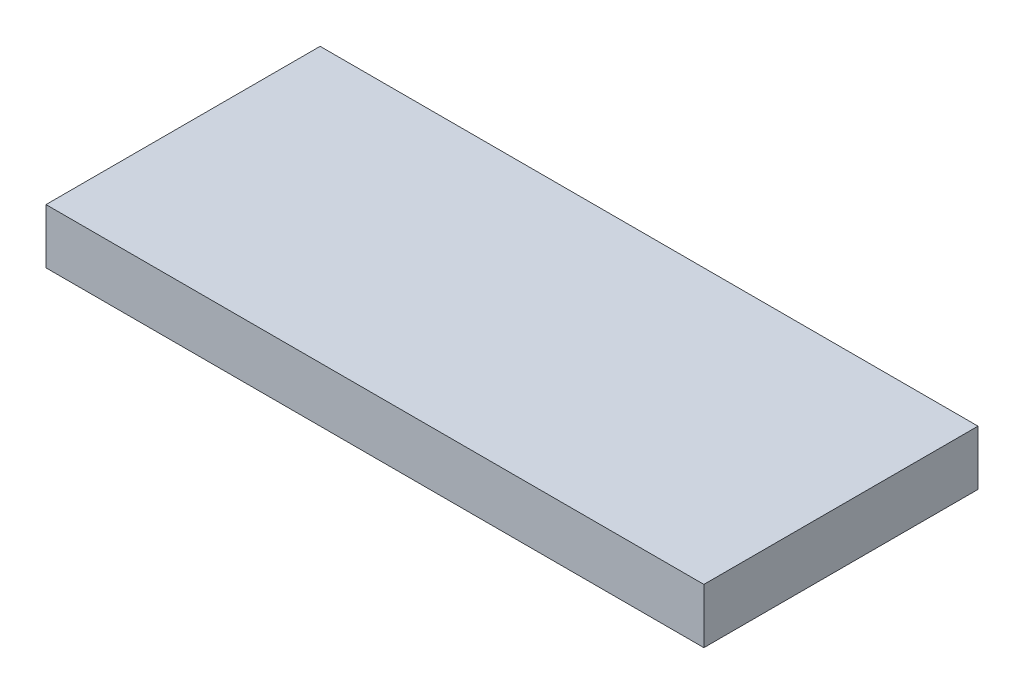
ISO-10303-21;
HEADER;
FILE_DESCRIPTION(('STEP AP214'),'2;1');
FILE_NAME('part.step','',(''),(''),'','','');
FILE_SCHEMA(('AUTOMOTIVE_DESIGN { 1 0 10303 214 1 1 1 1 }'));
ENDSEC;
DATA;
#1=APPLICATION_CONTEXT('core data for automotive mechanical design processes');
#2=APPLICATION_PROTOCOL_DEFINITION('international standard','automotive_design',2000,#1);
#3=PRODUCT_CONTEXT('',#1,'mechanical');
#4=PRODUCT('Part','Part','',(#3));
#5=PRODUCT_RELATED_PRODUCT_CATEGORY('part','',(#4));
#6=PRODUCT_DEFINITION_FORMATION('','',#4);
#7=PRODUCT_DEFINITION_CONTEXT('part definition',#1,'design');
#8=PRODUCT_DEFINITION('design','',#6,#7);
#9=PRODUCT_DEFINITION_SHAPE('','',#8);
#10=(LENGTH_UNIT() NAMED_UNIT(*) SI_UNIT(.MILLI.,.METRE.));
#11=(NAMED_UNIT(*) PLANE_ANGLE_UNIT() SI_UNIT($,.RADIAN.));
#12=(NAMED_UNIT(*) SI_UNIT($,.STERADIAN.) SOLID_ANGLE_UNIT());
#13=UNCERTAINTY_MEASURE_WITH_UNIT(LENGTH_MEASURE(1.E-05),#10,'distance_accuracy_value','');
#14=(GEOMETRIC_REPRESENTATION_CONTEXT(3) GLOBAL_UNCERTAINTY_ASSIGNED_CONTEXT((#13)) GLOBAL_UNIT_ASSIGNED_CONTEXT((#10,
#11,#12)) REPRESENTATION_CONTEXT('',''));
#15=CARTESIAN_POINT('',(0.,0.,0.));
#16=DIRECTION('',(0.,0.,1.));
#17=DIRECTION('',(1.,0.,0.));
#18=AXIS2_PLACEMENT_3D('',#15,#16,#17);
#19=CARTESIAN_POINT('',(-375.757438962069,100.,-304.757641794197));
#20=DIRECTION('',(1.,0.,0.));
#21=DIRECTION('',(0.,0.,-1.));
#22=AXIS2_PLACEMENT_3D('',#19,#20,#21);
#23=PLANE('',#22);
#24=DIRECTION('',(0.,0.,1.));
#25=VECTOR('',#24,1.);
#26=CARTESIAN_POINT('',(-375.757438962069,0.,-304.757641794197));
#27=LINE('',#26,#25);
#28=CARTESIAN_POINT('',(-375.757438962069,0.,-304.757641794197));
#29=VERTEX_POINT('',#28);
#30=CARTESIAN_POINT('',(-375.757438962069,0.,195.242358205803));
#31=VERTEX_POINT('',#30);
#32=EDGE_CURVE('E96',#29,#31,#27,.T.);
#33=ORIENTED_EDGE('',*,*,#32,.T.);
#34=DIRECTION('',(0.,-1.,0.));
#35=VECTOR('',#34,1.);
#36=CARTESIAN_POINT('',(-375.757438962069,100.,195.242358205803));
#37=LINE('',#36,#35);
#38=CARTESIAN_POINT('',(-375.757438962069,100.,195.242358205803));
#39=VERTEX_POINT('',#38);
#40=EDGE_CURVE('E11',#39,#31,#37,.T.);
#41=ORIENTED_EDGE('',*,*,#40,.F.);
#42=DIRECTION('',(0.,0.,1.));
#43=VECTOR('',#42,1.);
#44=CARTESIAN_POINT('',(-375.757438962069,100.,-304.757641794197));
#45=LINE('',#44,#43);
#46=CARTESIAN_POINT('',(-375.757438962069,100.,-304.757641794197));
#47=VERTEX_POINT('',#46);
#48=EDGE_CURVE('E84',#47,#39,#45,.T.);
#49=ORIENTED_EDGE('',*,*,#48,.F.);
#50=DIRECTION('',(0.,-1.,0.));
#51=VECTOR('',#50,1.);
#52=CARTESIAN_POINT('',(-375.757438962069,100.,-304.757641794197));
#53=LINE('',#52,#51);
#54=EDGE_CURVE('E92',#47,#29,#53,.T.);
#55=ORIENTED_EDGE('',*,*,#54,.T.);
#56=EDGE_LOOP('',(#33,#41,#49,#55));
#57=FACE_BOUND('',#56,.T.);
#58=ADVANCED_FACE('F33',(#57),#23,.F.);
#59=CARTESIAN_POINT('',(-375.757438962069,100.,195.242358205803));
#60=DIRECTION('',(0.,0.,-1.));
#61=DIRECTION('',(-1.,0.,0.));
#62=AXIS2_PLACEMENT_3D('',#59,#60,#61);
#63=PLANE('',#62);
#64=DIRECTION('',(1.,0.,0.));
#65=VECTOR('',#64,1.);
#66=CARTESIAN_POINT('',(-375.757438962069,0.,195.242358205803));
#67=LINE('',#66,#65);
#68=CARTESIAN_POINT('',(824.242561037931,0.,195.242358205803));
#69=VERTEX_POINT('',#68);
#70=EDGE_CURVE('E88',#31,#69,#67,.T.);
#71=ORIENTED_EDGE('',*,*,#70,.T.);
#72=DIRECTION('',(0.,-1.,0.));
#73=VECTOR('',#72,1.);
#74=CARTESIAN_POINT('',(824.242561037931,100.,195.242358205803));
#75=LINE('',#74,#73);
#76=CARTESIAN_POINT('',(824.242561037931,100.,195.242358205803));
#77=VERTEX_POINT('',#76);
#78=EDGE_CURVE('E41',#77,#69,#75,.T.);
#79=ORIENTED_EDGE('',*,*,#78,.F.);
#80=DIRECTION('',(1.,0.,0.));
#81=VECTOR('',#80,1.);
#82=CARTESIAN_POINT('',(-375.757438962069,100.,195.242358205803));
#83=LINE('',#82,#81);
#84=EDGE_CURVE('E79',#39,#77,#83,.T.);
#85=ORIENTED_EDGE('',*,*,#84,.F.);
#86=ORIENTED_EDGE('',*,*,#40,.T.);
#87=EDGE_LOOP('',(#71,#79,#85,#86));
#88=FACE_BOUND('',#87,.T.);
#89=ADVANCED_FACE('F87',(#88),#63,.F.);
#90=CARTESIAN_POINT('',(824.242561037931,100.,-304.757641794197));
#91=DIRECTION('',(-1.,0.,0.));
#92=DIRECTION('',(0.,0.,1.));
#93=AXIS2_PLACEMENT_3D('',#90,#91,#92);
#94=PLANE('',#93);
#95=DIRECTION('',(0.,0.,-1.));
#96=VECTOR('',#95,1.);
#97=CARTESIAN_POINT('',(824.242561037931,0.,-304.757641794197));
#98=LINE('',#97,#96);
#99=CARTESIAN_POINT('',(824.242561037931,0.,-304.757641794197));
#100=VERTEX_POINT('',#99);
#101=EDGE_CURVE('E66',#69,#100,#98,.T.);
#102=ORIENTED_EDGE('',*,*,#101,.T.);
#103=DIRECTION('',(0.,-1.,0.));
#104=VECTOR('',#103,1.);
#105=CARTESIAN_POINT('',(824.242561037931,100.,-304.757641794197));
#106=LINE('',#105,#104);
#107=CARTESIAN_POINT('',(824.242561037931,100.,-304.757641794197));
#108=VERTEX_POINT('',#107);
#109=EDGE_CURVE('E89',#108,#100,#106,.T.);
#110=ORIENTED_EDGE('',*,*,#109,.F.);
#111=DIRECTION('',(0.,0.,-1.));
#112=VECTOR('',#111,1.);
#113=CARTESIAN_POINT('',(824.242561037931,100.,-304.757641794197));
#114=LINE('',#113,#112);
#115=EDGE_CURVE('E82',#77,#108,#114,.T.);
#116=ORIENTED_EDGE('',*,*,#115,.F.);
#117=ORIENTED_EDGE('',*,*,#78,.T.);
#118=EDGE_LOOP('',(#102,#110,#116,#117));
#119=FACE_BOUND('',#118,.T.);
#120=ADVANCED_FACE('F90',(#119),#94,.F.);
#121=CARTESIAN_POINT('',(-375.757438962069,100.,-304.757641794197));
#122=DIRECTION('',(0.,0.,1.));
#123=DIRECTION('',(1.,0.,0.));
#124=AXIS2_PLACEMENT_3D('',#121,#122,#123);
#125=PLANE('',#124);
#126=DIRECTION('',(-1.,0.,0.));
#127=VECTOR('',#126,1.);
#128=CARTESIAN_POINT('',(-375.757438962069,0.,-304.757641794197));
#129=LINE('',#128,#127);
#130=EDGE_CURVE('E72',#100,#29,#129,.T.);
#131=ORIENTED_EDGE('',*,*,#130,.T.);
#132=ORIENTED_EDGE('',*,*,#54,.F.);
#133=DIRECTION('',(-1.,0.,0.));
#134=VECTOR('',#133,1.);
#135=CARTESIAN_POINT('',(-375.757438962069,100.,-304.757641794197));
#136=LINE('',#135,#134);
#137=EDGE_CURVE('E49',#108,#47,#136,.T.);
#138=ORIENTED_EDGE('',*,*,#137,.F.);
#139=ORIENTED_EDGE('',*,*,#109,.T.);
#140=EDGE_LOOP('',(#131,#132,#138,#139));
#141=FACE_BOUND('',#140,.T.);
#142=ADVANCED_FACE('F103',(#141),#125,.F.);
#143=CARTESIAN_POINT('',(0.,100.,0.));
#144=DIRECTION('',(0.,1.,0.));
#145=DIRECTION('',(0.,0.,1.));
#146=AXIS2_PLACEMENT_3D('',#143,#144,#145);
#147=PLANE('',#146);
#148=ORIENTED_EDGE('',*,*,#48,.T.);
#149=ORIENTED_EDGE('',*,*,#84,.T.);
#150=ORIENTED_EDGE('',*,*,#115,.T.);
#151=ORIENTED_EDGE('',*,*,#137,.T.);
#152=EDGE_LOOP('',(#148,#149,#150,#151));
#153=FACE_BOUND('',#152,.T.);
#154=ADVANCED_FACE('F80',(#153),#147,.T.);
#155=CARTESIAN_POINT('',(0.,0.,0.));
#156=DIRECTION('',(0.,1.,0.));
#157=DIRECTION('',(0.,0.,1.));
#158=AXIS2_PLACEMENT_3D('',#155,#156,#157);
#159=PLANE('',#158);
#160=ORIENTED_EDGE('',*,*,#32,.F.);
#161=ORIENTED_EDGE('',*,*,#130,.F.);
#162=ORIENTED_EDGE('',*,*,#101,.F.);
#163=ORIENTED_EDGE('',*,*,#70,.F.);
#164=EDGE_LOOP('',(#160,#161,#162,#163));
#165=FACE_BOUND('',#164,.T.);
#166=ADVANCED_FACE('F106',(#165),#159,.F.);
#167=CLOSED_SHELL('',(#58,#89,#120,#142,#154,#166));
#168=MANIFOLD_SOLID_BREP('B2',#167);
#169=ADVANCED_BREP_SHAPE_REPRESENTATION('',(#18,#168),#14);
#170=SHAPE_DEFINITION_REPRESENTATION(#9,#169);
ENDSEC;
END-ISO-10303-21;
